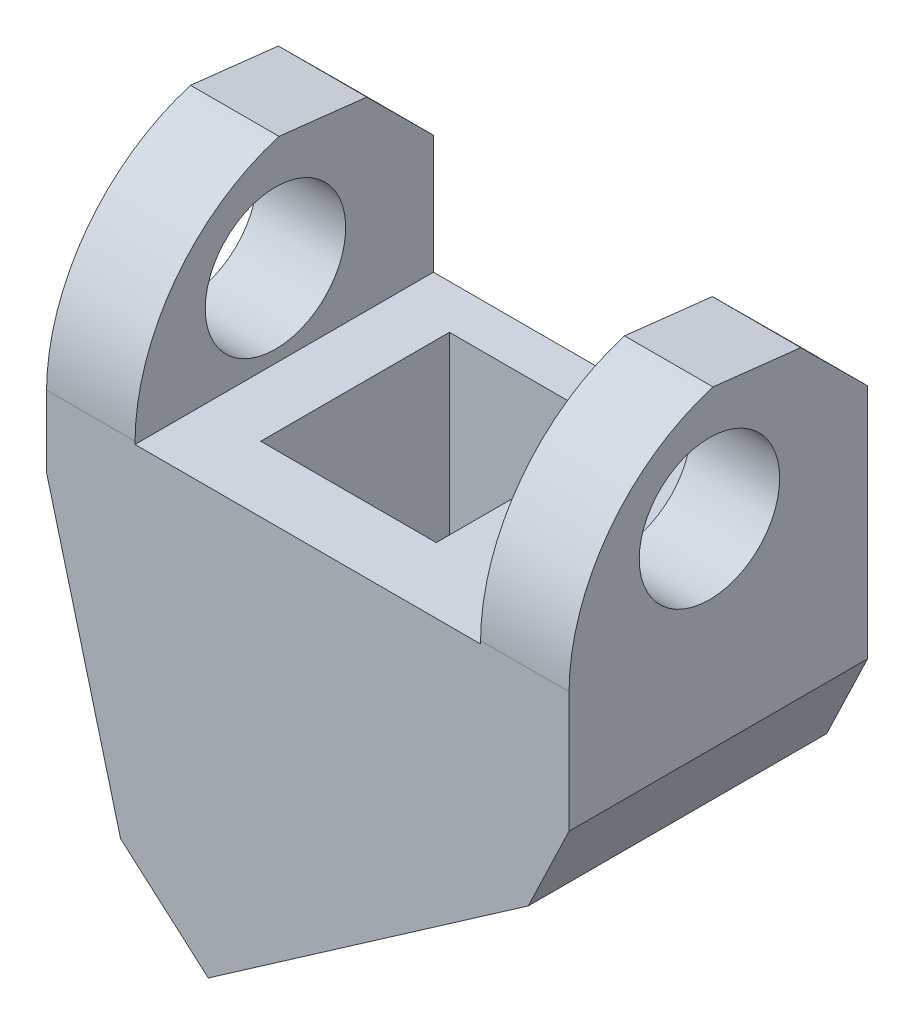
ISO-10303-21;
HEADER;
FILE_DESCRIPTION(('STEP AP214'),'2;1');
FILE_NAME('part.step','',(''),(''),'','','');
FILE_SCHEMA(('AUTOMOTIVE_DESIGN { 1 0 10303 214 1 1 1 1 }'));
ENDSEC;
DATA;
#1=APPLICATION_CONTEXT('core data for automotive mechanical design processes');
#2=APPLICATION_PROTOCOL_DEFINITION('international standard','automotive_design',2000,#1);
#3=PRODUCT_CONTEXT('',#1,'mechanical');
#4=PRODUCT('Part','Part','',(#3));
#5=PRODUCT_RELATED_PRODUCT_CATEGORY('part','',(#4));
#6=PRODUCT_DEFINITION_FORMATION('','',#4);
#7=PRODUCT_DEFINITION_CONTEXT('part definition',#1,'design');
#8=PRODUCT_DEFINITION('design','',#6,#7);
#9=PRODUCT_DEFINITION_SHAPE('','',#8);
#10=(LENGTH_UNIT() NAMED_UNIT(*) SI_UNIT(.MILLI.,.METRE.));
#11=(NAMED_UNIT(*) PLANE_ANGLE_UNIT() SI_UNIT($,.RADIAN.));
#12=(NAMED_UNIT(*) SI_UNIT($,.STERADIAN.) SOLID_ANGLE_UNIT());
#13=UNCERTAINTY_MEASURE_WITH_UNIT(LENGTH_MEASURE(1.E-05),#10,'distance_accuracy_value','');
#14=(GEOMETRIC_REPRESENTATION_CONTEXT(3) GLOBAL_UNCERTAINTY_ASSIGNED_CONTEXT((#13)) GLOBAL_UNIT_ASSIGNED_CONTEXT((#10,
#11,#12)) REPRESENTATION_CONTEXT('',''));
#15=CARTESIAN_POINT('',(0.,0.,0.));
#16=DIRECTION('',(0.,0.,1.));
#17=DIRECTION('',(1.,0.,0.));
#18=AXIS2_PLACEMENT_3D('',#15,#16,#17);
#19=CARTESIAN_POINT('',(14.2253875938206,5.67373352379112,17.));
#20=DIRECTION('',(-0.570729388453815,0.82113821318651,0.));
#21=DIRECTION('',(-0.82113821318651,-0.570729388453815,0.));
#22=AXIS2_PLACEMENT_3D('',#19,#20,#21);
#23=PLANE('',#22);
#24=DIRECTION('',(0.82113821318651,0.570729388453815,0.));
#25=VECTOR('',#24,1.);
#26=CARTESIAN_POINT('',(14.2253875938206,5.67373352379112,0.));
#27=LINE('',#26,#25);
#28=CARTESIAN_POINT('',(-4.00388073891992,-6.99645889988358,0.));
#29=VERTEX_POINT('',#28);
#30=CARTESIAN_POINT('',(14.2253875938206,5.67373352379112,0.));
#31=VERTEX_POINT('',#30);
#32=EDGE_CURVE('E312',#29,#31,#27,.T.);
#33=ORIENTED_EDGE('',*,*,#32,.T.);
#34=DIRECTION('',(0.,0.,-1.));
#35=VECTOR('',#34,1.);
#36=CARTESIAN_POINT('',(14.2253875938206,5.67373352379112,17.));
#37=LINE('',#36,#35);
#38=CARTESIAN_POINT('',(14.2253875938206,5.67373352379112,17.));
#39=VERTEX_POINT('',#38);
#40=EDGE_CURVE('E333',#39,#31,#37,.T.);
#41=ORIENTED_EDGE('',*,*,#40,.F.);
#42=DIRECTION('',(0.82113821318651,0.570729388453815,0.));
#43=VECTOR('',#42,1.);
#44=CARTESIAN_POINT('',(14.2253875938206,5.67373352379112,17.));
#45=LINE('',#44,#43);
#46=CARTESIAN_POINT('',(-4.00388073891992,-6.99645889988358,17.));
#47=VERTEX_POINT('',#46);
#48=EDGE_CURVE('E292',#47,#39,#45,.T.);
#49=ORIENTED_EDGE('',*,*,#48,.F.);
#50=DIRECTION('',(0.,0.,-1.));
#51=VECTOR('',#50,1.);
#52=CARTESIAN_POINT('',(-4.00388073891992,-6.99645889988358,17.));
#53=LINE('',#52,#51);
#54=EDGE_CURVE('E336',#47,#29,#53,.T.);
#55=ORIENTED_EDGE('',*,*,#54,.T.);
#56=EDGE_LOOP('',(#33,#41,#49,#55));
#57=FACE_BOUND('',#56,.T.);
#58=DIRECTION('',(0.82113821318651,0.570729388453815,0.));
#59=VECTOR('',#58,1.);
#60=CARTESIAN_POINT('',(-0.514518451916481,-4.57118922886543,13.26));
#61=LINE('',#60,#59);
#62=CARTESIAN_POINT('',(-0.719327886173876,-4.71354134606832,13.26));
#63=VERTEX_POINT('',#62);
#64=CARTESIAN_POINT('',(7.05685099270237,0.691265962589312,13.26));
#65=VERTEX_POINT('',#64);
#66=EDGE_CURVE('E219',#63,#65,#61,.T.);
#67=ORIENTED_EDGE('',*,*,#66,.T.);
#68=DIRECTION('',(0.,0.,-1.));
#69=VECTOR('',#68,1.);
#70=CARTESIAN_POINT('',(7.05685099270237,0.691265962589311,13.26));
#71=LINE('',#70,#69);
#72=CARTESIAN_POINT('',(7.05685099270237,0.691265962589312,2.51));
#73=VERTEX_POINT('',#72);
#74=EDGE_CURVE('E215',#65,#73,#71,.T.);
#75=ORIENTED_EDGE('',*,*,#74,.T.);
#76=DIRECTION('',(-0.82113821318651,-0.570729388453815,0.));
#77=VECTOR('',#76,1.);
#78=CARTESIAN_POINT('',(-0.51451845191648,-4.57118922886543,2.51));
#79=LINE('',#78,#77);
#80=CARTESIAN_POINT('',(-0.719327886173878,-4.71354134606832,2.51));
#81=VERTEX_POINT('',#80);
#82=EDGE_CURVE('E218',#73,#81,#79,.T.);
#83=ORIENTED_EDGE('',*,*,#82,.T.);
#84=DIRECTION('',(0.,0.,1.));
#85=VECTOR('',#84,1.);
#86=CARTESIAN_POINT('',(-0.719327886173879,-4.71354134606832,13.26));
#87=LINE('',#86,#85);
#88=EDGE_CURVE('E221',#81,#63,#87,.T.);
#89=ORIENTED_EDGE('',*,*,#88,.T.);
#90=EDGE_LOOP('',(#67,#75,#83,#89));
#91=FACE_BOUND('',#90,.T.);
#92=ADVANCED_FACE('F33',(#57,#91),#23,.F.);
#93=CARTESIAN_POINT('',(-13.2171428571429,13.3371428571428,17.));
#94=DIRECTION('',(1.,0.,0.));
#95=DIRECTION('',(0.,0.,-1.));
#96=AXIS2_PLACEMENT_3D('',#93,#94,#95);
#97=PLANE('',#96);
#98=CARTESIAN_POINT('',(-13.2171428571429,21.9371428571428,9.));
#99=DIRECTION('',(-1.,0.,0.));
#100=DIRECTION('',(0.,0.,1.));
#101=AXIS2_PLACEMENT_3D('',#98,#99,#100);
#102=CIRCLE('',#101,4.);
#103=CARTESIAN_POINT('',(-13.2171428571429,21.9371428571428,13.));
#104=VERTEX_POINT('',#103);
#105=EDGE_CURVE('E465',#104,#104,#102,.T.);
#106=ORIENTED_EDGE('',*,*,#105,.F.);
#107=EDGE_LOOP('',(#106));
#108=FACE_BOUND('',#107,.T.);
#109=DIRECTION('',(0.,0.111815815852002,0.99372894861997));
#110=VECTOR('',#109,1.);
#111=CARTESIAN_POINT('',(-13.2171428571429,29.0610495860065,15.2307233157388));
#112=LINE('',#111,#110);
#113=CARTESIAN_POINT('',(-13.2171428571429,27.7745356391118,3.79722312534748));
#114=VERTEX_POINT('',#113);
#115=CARTESIAN_POINT('',(-13.2171428571429,28.3371428571428,8.79722312534747));
#116=VERTEX_POINT('',#115);
#117=EDGE_CURVE('E264',#114,#116,#112,.T.);
#118=ORIENTED_EDGE('',*,*,#117,.F.);
#119=DIRECTION('',(0.,0.705253158861616,0.708955557080775));
#120=VECTOR('',#119,1.);
#121=CARTESIAN_POINT('',(-13.2171428571429,27.1949340284675,3.21457875488832));
#122=LINE('',#121,#120);
#123=CARTESIAN_POINT('',(-13.2171428571429,23.9971428571428,0.));
#124=VERTEX_POINT('',#123);
#125=EDGE_CURVE('E266',#124,#114,#122,.T.);
#126=ORIENTED_EDGE('',*,*,#125,.F.);
#127=DIRECTION('',(0.,-1.,0.));
#128=VECTOR('',#127,1.);
#129=CARTESIAN_POINT('',(-13.2171428571429,13.3371428571428,0.));
#130=LINE('',#129,#128);
#131=CARTESIAN_POINT('',(-13.2171428571429,13.3371428571428,0.));
#132=VERTEX_POINT('',#131);
#133=EDGE_CURVE('E284',#124,#132,#130,.T.);
#134=ORIENTED_EDGE('',*,*,#133,.T.);
#135=DIRECTION('',(0.,0.,-1.));
#136=VECTOR('',#135,1.);
#137=CARTESIAN_POINT('',(-13.2171428571429,13.3371428571428,17.));
#138=LINE('',#137,#136);
#139=CARTESIAN_POINT('',(-13.2171428571429,13.3371428571428,17.));
#140=VERTEX_POINT('',#139);
#141=EDGE_CURVE('E342',#140,#132,#138,.T.);
#142=ORIENTED_EDGE('',*,*,#141,.F.);
#143=DIRECTION('',(0.,-1.,0.));
#144=VECTOR('',#143,1.);
#145=CARTESIAN_POINT('',(-13.2171428571429,13.3371428571428,17.));
#146=LINE('',#145,#144);
#147=CARTESIAN_POINT('',(-13.2171428571429,17.4025988995306,17.));
#148=VERTEX_POINT('',#147);
#149=EDGE_CURVE('E285',#148,#140,#146,.T.);
#150=ORIENTED_EDGE('',*,*,#149,.F.);
#151=CARTESIAN_POINT('',(-13.2171428571429,17.3198708783368,5.50029756582766));
#152=DIRECTION('',(1.,0.,0.));
#153=DIRECTION('',(0.,0.,-1.));
#154=AXIS2_PLACEMENT_3D('',#151,#152,#153);
#155=CIRCLE('',#154,11.5);
#156=EDGE_CURVE('E281',#148,#116,#155,.F.);
#157=ORIENTED_EDGE('',*,*,#156,.T.);
#158=EDGE_LOOP('',(#118,#126,#134,#142,#150,#157));
#159=FACE_BOUND('',#158,.T.);
#160=ADVANCED_FACE('F35',(#108,#159),#97,.F.);
#161=CARTESIAN_POINT('',(-8.17714285714285,28.3371428571428,17.));
#162=DIRECTION('',(-1.,0.,0.));
#163=DIRECTION('',(0.,-1.,0.));
#164=AXIS2_PLACEMENT_3D('',#161,#162,#163);
#165=PLANE('',#164);
#166=CARTESIAN_POINT('',(-8.17714285714285,21.9371428571428,9.));
#167=DIRECTION('',(-1.,0.,0.));
#168=DIRECTION('',(0.,-1.,0.));
#169=AXIS2_PLACEMENT_3D('',#166,#167,#168);
#170=CIRCLE('',#169,4.);
#171=CARTESIAN_POINT('',(-8.17714285714285,17.9371428571428,9.));
#172=VERTEX_POINT('',#171);
#173=EDGE_CURVE('E460',#172,#172,#170,.T.);
#174=ORIENTED_EDGE('',*,*,#173,.T.);
#175=EDGE_LOOP('',(#174));
#176=FACE_BOUND('',#175,.T.);
#177=DIRECTION('',(0.,0.111815815852002,0.99372894861997));
#178=VECTOR('',#177,1.);
#179=CARTESIAN_POINT('',(-8.17714285714285,27.005349844249,-3.03868094956568));
#180=LINE('',#179,#178);
#181=CARTESIAN_POINT('',(-8.17714285714285,27.7745356391118,3.79722312534748));
#182=VERTEX_POINT('',#181);
#183=CARTESIAN_POINT('',(-8.17714285714285,28.3371428571428,8.79722312534747));
#184=VERTEX_POINT('',#183);
#185=EDGE_CURVE('E256',#182,#184,#180,.T.);
#186=ORIENTED_EDGE('',*,*,#185,.T.);
#187=CARTESIAN_POINT('',(-8.17714285714285,17.3198708783368,5.50029756582766));
#188=DIRECTION('',(-1.,0.,0.));
#189=DIRECTION('',(0.,-1.,0.));
#190=AXIS2_PLACEMENT_3D('',#187,#188,#189);
#191=CIRCLE('',#190,11.5);
#192=CARTESIAN_POINT('',(-8.17714285714285,17.4025988995306,17.));
#193=VERTEX_POINT('',#192);
#194=EDGE_CURVE('E272',#184,#193,#191,.F.);
#195=ORIENTED_EDGE('',*,*,#194,.T.);
#196=DIRECTION('',(0.,1.,0.));
#197=VECTOR('',#196,1.);
#198=CARTESIAN_POINT('',(-8.17714285714285,28.3371428571428,17.));
#199=LINE('',#198,#197);
#200=CARTESIAN_POINT('',(-8.17714285714285,17.2371428571428,17.));
#201=VERTEX_POINT('',#200);
#202=EDGE_CURVE('E303',#201,#193,#199,.T.);
#203=ORIENTED_EDGE('',*,*,#202,.F.);
#204=DIRECTION('',(0.,0.,-1.));
#205=VECTOR('',#204,1.);
#206=CARTESIAN_POINT('',(-8.17714285714285,17.2371428571428,17.));
#207=LINE('',#206,#205);
#208=CARTESIAN_POINT('',(-8.17714285714285,17.2371428571428,0.));
#209=VERTEX_POINT('',#208);
#210=EDGE_CURVE('E306',#201,#209,#207,.T.);
#211=ORIENTED_EDGE('',*,*,#210,.T.);
#212=DIRECTION('',(0.,1.,0.));
#213=VECTOR('',#212,1.);
#214=CARTESIAN_POINT('',(-8.17714285714285,28.3371428571428,0.));
#215=LINE('',#214,#213);
#216=CARTESIAN_POINT('',(-8.17714285714285,23.9971428571428,0.));
#217=VERTEX_POINT('',#216);
#218=EDGE_CURVE('E288',#209,#217,#215,.T.);
#219=ORIENTED_EDGE('',*,*,#218,.T.);
#220=DIRECTION('',(0.,0.705253158861616,0.708955557080775));
#221=VECTOR('',#220,1.);
#222=CARTESIAN_POINT('',(-8.17714285714285,12.0613955146002,-11.9984069551231));
#223=LINE('',#222,#221);
#224=EDGE_CURVE('E259',#217,#182,#223,.T.);
#225=ORIENTED_EDGE('',*,*,#224,.T.);
#226=EDGE_LOOP('',(#186,#195,#203,#211,#219,#225));
#227=FACE_BOUND('',#226,.T.);
#228=ADVANCED_FACE('F370',(#176,#227),#165,.F.);
#229=CARTESIAN_POINT('',(0.,0.,0.));
#230=DIRECTION('',(0.,0.,-1.));
#231=DIRECTION('',(-1.,0.,0.));
#232=AXIS2_PLACEMENT_3D('',#229,#230,#231);
#233=PLANE('',#232);
#234=DIRECTION('',(-1.,0.,0.));
#235=VECTOR('',#234,1.);
#236=CARTESIAN_POINT('',(18.8228571428571,23.9971428571429,0.));
#237=LINE('',#236,#235);
#238=CARTESIAN_POINT('',(16.5455947586633,23.9971428571429,0.));
#239=VERTEX_POINT('',#238);
#240=CARTESIAN_POINT('',(11.5055947586633,23.9971428571428,0.));
#241=VERTEX_POINT('',#240);
#242=EDGE_CURVE('E224',#239,#241,#237,.T.);
#243=ORIENTED_EDGE('',*,*,#242,.F.);
#244=DIRECTION('',(0.,1.,0.));
#245=VECTOR('',#244,1.);
#246=CARTESIAN_POINT('',(16.5455947586633,28.3371428571428,0.));
#247=LINE('',#246,#245);
#248=CARTESIAN_POINT('',(16.5455947586633,10.5166188943334,0.));
#249=VERTEX_POINT('',#248);
#250=EDGE_CURVE('E316',#249,#239,#247,.T.);
#251=ORIENTED_EDGE('',*,*,#250,.F.);
#252=DIRECTION('',(0.432068373341291,0.901840851125192,0.));
#253=VECTOR('',#252,1.);
#254=CARTESIAN_POINT('',(16.5455947586633,10.5166188943334,0.));
#255=LINE('',#254,#253);
#256=EDGE_CURVE('E314',#31,#249,#255,.T.);
#257=ORIENTED_EDGE('',*,*,#256,.F.);
#258=ORIENTED_EDGE('',*,*,#32,.F.);
#259=DIRECTION('',(0.752427599560253,-0.658674963407595,0.));
#260=VECTOR('',#259,1.);
#261=CARTESIAN_POINT('',(-4.00388073891992,-6.99645889988358,0.));
#262=LINE('',#261,#260);
#263=CARTESIAN_POINT('',(-9.,-2.62285714285716,0.));
#264=VERTEX_POINT('',#263);
#265=EDGE_CURVE('E310',#264,#29,#262,.T.);
#266=ORIENTED_EDGE('',*,*,#265,.F.);
#267=DIRECTION('',(0.255464385431467,-0.966818466815835,0.));
#268=VECTOR('',#267,1.);
#269=CARTESIAN_POINT('',(-9.,-2.62285714285716,0.));
#270=LINE('',#269,#268);
#271=EDGE_CURVE('E308',#132,#264,#270,.T.);
#272=ORIENTED_EDGE('',*,*,#271,.F.);
#273=ORIENTED_EDGE('',*,*,#133,.F.);
#274=DIRECTION('',(1.,0.,0.));
#275=VECTOR('',#274,1.);
#276=CARTESIAN_POINT('',(0.,23.9971428571429,0.));
#277=LINE('',#276,#275);
#278=EDGE_CURVE('E42',#124,#217,#277,.T.);
#279=ORIENTED_EDGE('',*,*,#278,.T.);
#280=ORIENTED_EDGE('',*,*,#218,.F.);
#281=DIRECTION('',(-1.,0.,0.));
#282=VECTOR('',#281,1.);
#283=CARTESIAN_POINT('',(-8.17714285714285,17.2371428571428,0.));
#284=LINE('',#283,#282);
#285=CARTESIAN_POINT('',(11.5055947586633,17.2371428571428,0.));
#286=VERTEX_POINT('',#285);
#287=EDGE_CURVE('E321',#286,#209,#284,.T.);
#288=ORIENTED_EDGE('',*,*,#287,.F.);
#289=DIRECTION('',(0.,-1.,0.));
#290=VECTOR('',#289,1.);
#291=CARTESIAN_POINT('',(11.5055947586633,17.2371428571428,0.));
#292=LINE('',#291,#290);
#293=EDGE_CURVE('E319',#241,#286,#292,.T.);
#294=ORIENTED_EDGE('',*,*,#293,.F.);
#295=EDGE_LOOP('',(#243,#251,#257,#258,#266,#272,#273,#279,#280,#288,#294));
#296=FACE_BOUND('',#295,.T.);
#297=ADVANCED_FACE('F409',(#296),#233,.T.);
#298=CARTESIAN_POINT('',(-9.,-2.62285714285716,17.));
#299=DIRECTION('',(0.966818466815836,0.255464385431467,0.));
#300=DIRECTION('',(-0.255464385431467,0.966818466815836,0.));
#301=AXIS2_PLACEMENT_3D('',#298,#299,#300);
#302=PLANE('',#301);
#303=ORIENTED_EDGE('',*,*,#271,.T.);
#304=DIRECTION('',(0.,0.,-1.));
#305=VECTOR('',#304,1.);
#306=CARTESIAN_POINT('',(-9.,-2.62285714285716,17.));
#307=LINE('',#306,#305);
#308=CARTESIAN_POINT('',(-9.,-2.62285714285716,17.));
#309=VERTEX_POINT('',#308);
#310=EDGE_CURVE('E339',#309,#264,#307,.T.);
#311=ORIENTED_EDGE('',*,*,#310,.F.);
#312=DIRECTION('',(0.255464385431467,-0.966818466815835,0.));
#313=VECTOR('',#312,1.);
#314=CARTESIAN_POINT('',(-9.,-2.62285714285716,17.));
#315=LINE('',#314,#313);
#316=EDGE_CURVE('E287',#140,#309,#315,.T.);
#317=ORIENTED_EDGE('',*,*,#316,.F.);
#318=ORIENTED_EDGE('',*,*,#141,.T.);
#319=EDGE_LOOP('',(#303,#311,#317,#318));
#320=FACE_BOUND('',#319,.T.);
#321=ADVANCED_FACE('F383',(#320),#302,.F.);
#322=CARTESIAN_POINT('',(-4.00388073891992,-6.99645889988358,17.));
#323=DIRECTION('',(0.658674963407595,0.752427599560253,0.));
#324=DIRECTION('',(-0.752427599560253,0.658674963407595,0.));
#325=AXIS2_PLACEMENT_3D('',#322,#323,#324);
#326=PLANE('',#325);
#327=ORIENTED_EDGE('',*,*,#265,.T.);
#328=ORIENTED_EDGE('',*,*,#54,.F.);
#329=DIRECTION('',(0.752427599560253,-0.658674963407595,0.));
#330=VECTOR('',#329,1.);
#331=CARTESIAN_POINT('',(-4.00388073891992,-6.99645889988358,17.));
#332=LINE('',#331,#330);
#333=EDGE_CURVE('E290',#309,#47,#332,.T.);
#334=ORIENTED_EDGE('',*,*,#333,.F.);
#335=ORIENTED_EDGE('',*,*,#310,.T.);
#336=EDGE_LOOP('',(#327,#328,#334,#335));
#337=FACE_BOUND('',#336,.T.);
#338=ADVANCED_FACE('F389',(#337),#326,.F.);
#339=CARTESIAN_POINT('',(16.5455947586633,10.5166188943334,17.));
#340=DIRECTION('',(-0.901840851125192,0.432068373341291,0.));
#341=DIRECTION('',(-0.432068373341291,-0.901840851125192,0.));
#342=AXIS2_PLACEMENT_3D('',#339,#340,#341);
#343=PLANE('',#342);
#344=ORIENTED_EDGE('',*,*,#256,.T.);
#345=DIRECTION('',(0.,0.,-1.));
#346=VECTOR('',#345,1.);
#347=CARTESIAN_POINT('',(16.5455947586633,10.5166188943334,17.));
#348=LINE('',#347,#346);
#349=CARTESIAN_POINT('',(16.5455947586633,10.5166188943334,17.));
#350=VERTEX_POINT('',#349);
#351=EDGE_CURVE('E330',#350,#249,#348,.T.);
#352=ORIENTED_EDGE('',*,*,#351,.F.);
#353=DIRECTION('',(0.432068373341291,0.901840851125192,0.));
#354=VECTOR('',#353,1.);
#355=CARTESIAN_POINT('',(16.5455947586633,10.5166188943334,17.));
#356=LINE('',#355,#354);
#357=EDGE_CURVE('E294',#39,#350,#356,.T.);
#358=ORIENTED_EDGE('',*,*,#357,.F.);
#359=ORIENTED_EDGE('',*,*,#40,.T.);
#360=EDGE_LOOP('',(#344,#352,#358,#359));
#361=FACE_BOUND('',#360,.T.);
#362=ADVANCED_FACE('F399',(#361),#343,.F.);
#363=CARTESIAN_POINT('',(16.5455947586633,28.3371428571428,17.));
#364=DIRECTION('',(-1.,0.,0.));
#365=DIRECTION('',(0.,-1.,0.));
#366=AXIS2_PLACEMENT_3D('',#363,#364,#365);
#367=PLANE('',#366);
#368=CARTESIAN_POINT('',(16.5455947586633,21.9371428571428,9.));
#369=DIRECTION('',(-1.,0.,0.));
#370=DIRECTION('',(0.,-1.,0.));
#371=AXIS2_PLACEMENT_3D('',#368,#369,#370);
#372=CIRCLE('',#371,4.);
#373=CARTESIAN_POINT('',(16.5455947586633,17.9371428571428,9.));
#374=VERTEX_POINT('',#373);
#375=EDGE_CURVE('E458',#374,#374,#372,.T.);
#376=ORIENTED_EDGE('',*,*,#375,.T.);
#377=EDGE_LOOP('',(#376));
#378=FACE_BOUND('',#377,.T.);
#379=DIRECTION('',(0.,0.705253158861616,0.708955557080775));
#380=VECTOR('',#379,1.);
#381=CARTESIAN_POINT('',(16.5455947586633,34.6556642997318,10.714475946744));
#382=LINE('',#381,#380);
#383=CARTESIAN_POINT('',(16.5455947586633,27.7745356391118,3.79722312534748));
#384=VERTEX_POINT('',#383);
#385=EDGE_CURVE('E253',#239,#384,#382,.T.);
#386=ORIENTED_EDGE('',*,*,#385,.T.);
#387=DIRECTION('',(0.,0.111815815852002,0.99372894861997));
#388=VECTOR('',#387,1.);
#389=CARTESIAN_POINT('',(16.5455947586633,29.2485912361263,16.8974425126242));
#390=LINE('',#389,#388);
#391=CARTESIAN_POINT('',(16.5455947586633,28.3371428571428,8.79722312534747));
#392=VERTEX_POINT('',#391);
#393=EDGE_CURVE('E250',#384,#392,#390,.T.);
#394=ORIENTED_EDGE('',*,*,#393,.T.);
#395=CARTESIAN_POINT('',(16.5455947586633,17.3198708783368,5.50029756582766));
#396=DIRECTION('',(-1.,0.,0.));
#397=DIRECTION('',(0.,-1.,0.));
#398=AXIS2_PLACEMENT_3D('',#395,#396,#397);
#399=CIRCLE('',#398,11.5);
#400=CARTESIAN_POINT('',(16.5455947586633,17.4025988995306,17.));
#401=VERTEX_POINT('',#400);
#402=EDGE_CURVE('E278',#392,#401,#399,.F.);
#403=ORIENTED_EDGE('',*,*,#402,.T.);
#404=DIRECTION('',(0.,1.,0.));
#405=VECTOR('',#404,1.);
#406=CARTESIAN_POINT('',(16.5455947586633,28.3371428571428,17.));
#407=LINE('',#406,#405);
#408=EDGE_CURVE('E296',#350,#401,#407,.T.);
#409=ORIENTED_EDGE('',*,*,#408,.F.);
#410=ORIENTED_EDGE('',*,*,#351,.T.);
#411=ORIENTED_EDGE('',*,*,#250,.T.);
#412=EDGE_LOOP('',(#386,#394,#403,#409,#410,#411));
#413=FACE_BOUND('',#412,.T.);
#414=ADVANCED_FACE('F402',(#378,#413),#367,.F.);
#415=CARTESIAN_POINT('',(11.5055947586633,17.2371428571428,17.));
#416=DIRECTION('',(1.,0.,0.));
#417=DIRECTION('',(0.,1.,0.));
#418=AXIS2_PLACEMENT_3D('',#415,#416,#417);
#419=PLANE('',#418);
#420=CARTESIAN_POINT('',(11.5055947586633,21.9371428571428,9.));
#421=DIRECTION('',(1.,0.,0.));
#422=DIRECTION('',(0.,1.,0.));
#423=AXIS2_PLACEMENT_3D('',#420,#421,#422);
#424=CIRCLE('',#423,4.);
#425=CARTESIAN_POINT('',(11.5055947586633,25.9371428571428,9.));
#426=VERTEX_POINT('',#425);
#427=EDGE_CURVE('E37',#426,#426,#424,.T.);
#428=ORIENTED_EDGE('',*,*,#427,.T.);
#429=EDGE_LOOP('',(#428));
#430=FACE_BOUND('',#429,.T.);
#431=CARTESIAN_POINT('',(11.5055947586633,17.3198708783368,5.50029756582766));
#432=DIRECTION('',(1.,0.,0.));
#433=DIRECTION('',(0.,1.,0.));
#434=AXIS2_PLACEMENT_3D('',#431,#432,#433);
#435=CIRCLE('',#434,11.5);
#436=CARTESIAN_POINT('',(11.5055947586633,17.4025988995306,17.));
#437=VERTEX_POINT('',#436);
#438=CARTESIAN_POINT('',(11.5055947586633,28.3371428571428,8.79722312534747));
#439=VERTEX_POINT('',#438);
#440=EDGE_CURVE('E275',#437,#439,#435,.F.);
#441=ORIENTED_EDGE('',*,*,#440,.T.);
#442=DIRECTION('',(0.,-0.111815815852002,-0.99372894861997));
#443=VECTOR('',#442,1.);
#444=CARTESIAN_POINT('',(11.5055947586633,29.1098104150376,15.664070306929));
#445=LINE('',#444,#443);
#446=CARTESIAN_POINT('',(11.5055947586633,27.7745356391118,3.79722312534748));
#447=VERTEX_POINT('',#446);
#448=EDGE_CURVE('E247',#439,#447,#445,.T.);
#449=ORIENTED_EDGE('',*,*,#448,.T.);
#450=DIRECTION('',(0.,-0.705253158861616,-0.708955557080775));
#451=VECTOR('',#450,1.);
#452=CARTESIAN_POINT('',(11.5055947586633,29.1347238989962,5.16455202477079));
#453=LINE('',#452,#451);
#454=EDGE_CURVE('E11',#447,#241,#453,.T.);
#455=ORIENTED_EDGE('',*,*,#454,.T.);
#456=ORIENTED_EDGE('',*,*,#293,.T.);
#457=DIRECTION('',(0.,0.,-1.));
#458=VECTOR('',#457,1.);
#459=CARTESIAN_POINT('',(11.5055947586633,17.2371428571428,17.));
#460=LINE('',#459,#458);
#461=CARTESIAN_POINT('',(11.5055947586633,17.2371428571428,17.));
#462=VERTEX_POINT('',#461);
#463=EDGE_CURVE('E327',#462,#286,#460,.T.);
#464=ORIENTED_EDGE('',*,*,#463,.F.);
#465=DIRECTION('',(0.,-1.,0.));
#466=VECTOR('',#465,1.);
#467=CARTESIAN_POINT('',(11.5055947586633,17.2371428571428,17.));
#468=LINE('',#467,#466);
#469=EDGE_CURVE('E299',#437,#462,#468,.T.);
#470=ORIENTED_EDGE('',*,*,#469,.F.);
#471=EDGE_LOOP('',(#441,#449,#455,#456,#464,#470));
#472=FACE_BOUND('',#471,.T.);
#473=ADVANCED_FACE('F362',(#430,#472),#419,.F.);
#474=CARTESIAN_POINT('',(-8.17714285714285,17.2371428571428,17.));
#475=DIRECTION('',(0.,-1.,0.));
#476=DIRECTION('',(0.,0.,-1.));
#477=AXIS2_PLACEMENT_3D('',#474,#475,#476);
#478=PLANE('',#477);
#479=DIRECTION('',(1.,0.,0.));
#480=VECTOR('',#479,1.);
#481=CARTESIAN_POINT('',(-4.75714285714285,17.2371428571428,13.26));
#482=LINE('',#481,#480);
#483=CARTESIAN_POINT('',(-4.75714285714285,17.2371428571428,13.26));
#484=VERTEX_POINT('',#483);
#485=CARTESIAN_POINT('',(5.24285714285715,17.2371428571428,13.26));
#486=VERTEX_POINT('',#485);
#487=EDGE_CURVE('E194',#484,#486,#482,.T.);
#488=ORIENTED_EDGE('',*,*,#487,.F.);
#489=DIRECTION('',(0.,0.,1.));
#490=VECTOR('',#489,1.);
#491=CARTESIAN_POINT('',(-4.75714285714285,17.2371428571428,2.51));
#492=LINE('',#491,#490);
#493=CARTESIAN_POINT('',(-4.75714285714285,17.2371428571428,2.51));
#494=VERTEX_POINT('',#493);
#495=EDGE_CURVE('E49',#494,#484,#492,.T.);
#496=ORIENTED_EDGE('',*,*,#495,.F.);
#497=DIRECTION('',(-1.,0.,0.));
#498=VECTOR('',#497,1.);
#499=CARTESIAN_POINT('',(-4.75714285714285,17.2371428571428,2.51));
#500=LINE('',#499,#498);
#501=CARTESIAN_POINT('',(5.24285714285715,17.2371428571428,2.51));
#502=VERTEX_POINT('',#501);
#503=EDGE_CURVE('E202',#502,#494,#500,.T.);
#504=ORIENTED_EDGE('',*,*,#503,.F.);
#505=DIRECTION('',(0.,0.,-1.));
#506=VECTOR('',#505,1.);
#507=CARTESIAN_POINT('',(5.24285714285715,17.2371428571428,2.51));
#508=LINE('',#507,#506);
#509=EDGE_CURVE('E185',#486,#502,#508,.T.);
#510=ORIENTED_EDGE('',*,*,#509,.F.);
#511=EDGE_LOOP('',(#488,#496,#504,#510));
#512=FACE_BOUND('',#511,.T.);
#513=ORIENTED_EDGE('',*,*,#287,.T.);
#514=ORIENTED_EDGE('',*,*,#210,.F.);
#515=DIRECTION('',(-1.,0.,0.));
#516=VECTOR('',#515,1.);
#517=CARTESIAN_POINT('',(-8.17714285714285,17.2371428571428,17.));
#518=LINE('',#517,#516);
#519=EDGE_CURVE('E301',#462,#201,#518,.T.);
#520=ORIENTED_EDGE('',*,*,#519,.F.);
#521=ORIENTED_EDGE('',*,*,#463,.T.);
#522=EDGE_LOOP('',(#513,#514,#520,#521));
#523=FACE_BOUND('',#522,.T.);
#524=ADVANCED_FACE('F199',(#512,#523),#478,.F.);
#525=CARTESIAN_POINT('',(0.,0.,17.));
#526=DIRECTION('',(0.,0.,-1.));
#527=DIRECTION('',(-1.,0.,0.));
#528=AXIS2_PLACEMENT_3D('',#525,#526,#527);
#529=PLANE('',#528);
#530=ORIENTED_EDGE('',*,*,#408,.T.);
#531=DIRECTION('',(-1.,0.,0.));
#532=VECTOR('',#531,1.);
#533=CARTESIAN_POINT('',(18.8228571428572,17.4025988995306,17.));
#534=LINE('',#533,#532);
#535=EDGE_CURVE('E348',#401,#437,#534,.T.);
#536=ORIENTED_EDGE('',*,*,#535,.T.);
#537=ORIENTED_EDGE('',*,*,#469,.T.);
#538=ORIENTED_EDGE('',*,*,#519,.T.);
#539=ORIENTED_EDGE('',*,*,#202,.T.);
#540=EDGE_CURVE('E345',#193,#148,#534,.T.);
#541=ORIENTED_EDGE('',*,*,#540,.T.);
#542=ORIENTED_EDGE('',*,*,#149,.T.);
#543=ORIENTED_EDGE('',*,*,#316,.T.);
#544=ORIENTED_EDGE('',*,*,#333,.T.);
#545=ORIENTED_EDGE('',*,*,#48,.T.);
#546=ORIENTED_EDGE('',*,*,#357,.T.);
#547=EDGE_LOOP('',(#530,#536,#537,#538,#539,#541,#542,#543,#544,#545,#546));
#548=FACE_BOUND('',#547,.T.);
#549=ADVANCED_FACE('F356',(#548),#529,.F.);
#550=CARTESIAN_POINT('',(18.8228571428572,17.3198708783368,5.50029756582766));
#551=DIRECTION('',(-1.,0.,0.));
#552=DIRECTION('',(0.,-1.,0.));
#553=AXIS2_PLACEMENT_3D('',#550,#551,#552);
#554=CYLINDRICAL_SURFACE('',#553,11.5);
#555=ORIENTED_EDGE('',*,*,#540,.F.);
#556=ORIENTED_EDGE('',*,*,#194,.F.);
#557=DIRECTION('',(-1.,0.,0.));
#558=VECTOR('',#557,1.);
#559=CARTESIAN_POINT('',(18.8228571428571,28.3371428571428,8.79722312534747));
#560=LINE('',#559,#558);
#561=EDGE_CURVE('E268',#184,#116,#560,.T.);
#562=ORIENTED_EDGE('',*,*,#561,.T.);
#563=ORIENTED_EDGE('',*,*,#156,.F.);
#564=EDGE_LOOP('',(#555,#556,#562,#563));
#565=FACE_BOUND('',#564,.T.);
#566=ADVANCED_FACE('F375',(#565),#554,.T.);
#567=EDGE_CURVE('E269',#392,#439,#560,.T.);
#568=ORIENTED_EDGE('',*,*,#567,.T.);
#569=ORIENTED_EDGE('',*,*,#440,.F.);
#570=ORIENTED_EDGE('',*,*,#535,.F.);
#571=ORIENTED_EDGE('',*,*,#402,.F.);
#572=EDGE_LOOP('',(#568,#569,#570,#571));
#573=FACE_BOUND('',#572,.T.);
#574=ADVANCED_FACE('F403',(#573),#554,.T.);
#575=CARTESIAN_POINT('',(-25.1771428571429,12.0613955146002,-11.9984069551231));
#576=DIRECTION('',(0.,0.708955557080775,-0.705253158861616));
#577=DIRECTION('',(0.,0.705253158861616,0.708955557080775));
#578=AXIS2_PLACEMENT_3D('',#575,#576,#577);
#579=PLANE('',#578);
#580=ORIENTED_EDGE('',*,*,#125,.T.);
#581=DIRECTION('',(1.,0.,0.));
#582=VECTOR('',#581,1.);
#583=CARTESIAN_POINT('',(-25.1771428571429,27.7745356391118,3.79722312534748));
#584=LINE('',#583,#582);
#585=EDGE_CURVE('E262',#114,#182,#584,.T.);
#586=ORIENTED_EDGE('',*,*,#585,.T.);
#587=ORIENTED_EDGE('',*,*,#224,.F.);
#588=ORIENTED_EDGE('',*,*,#278,.F.);
#589=EDGE_LOOP('',(#580,#586,#587,#588));
#590=FACE_BOUND('',#589,.T.);
#591=ADVANCED_FACE('F411',(#590),#579,.T.);
#592=CARTESIAN_POINT('',(-25.1771428571429,27.005349844249,-3.03868094956568));
#593=DIRECTION('',(0.,0.99372894861997,-0.111815815852002));
#594=DIRECTION('',(0.,0.111815815852002,0.99372894861997));
#595=AXIS2_PLACEMENT_3D('',#592,#593,#594);
#596=PLANE('',#595);
#597=ORIENTED_EDGE('',*,*,#117,.T.);
#598=ORIENTED_EDGE('',*,*,#561,.F.);
#599=ORIENTED_EDGE('',*,*,#185,.F.);
#600=ORIENTED_EDGE('',*,*,#585,.F.);
#601=EDGE_LOOP('',(#597,#598,#599,#600));
#602=FACE_BOUND('',#601,.T.);
#603=ADVANCED_FACE('F414',(#602),#596,.T.);
#604=CARTESIAN_POINT('',(18.8228571428572,12.0613955146002,-11.9984069551231));
#605=DIRECTION('',(0.,-0.708955557080775,0.705253158861616));
#606=DIRECTION('',(0.,-0.705253158861616,-0.708955557080775));
#607=AXIS2_PLACEMENT_3D('',#604,#605,#606);
#608=PLANE('',#607);
#609=ORIENTED_EDGE('',*,*,#242,.T.);
#610=ORIENTED_EDGE('',*,*,#454,.F.);
#611=DIRECTION('',(-1.,0.,0.));
#612=VECTOR('',#611,1.);
#613=CARTESIAN_POINT('',(18.8228571428571,27.7745356391118,3.79722312534748));
#614=LINE('',#613,#612);
#615=EDGE_CURVE('E244',#384,#447,#614,.T.);
#616=ORIENTED_EDGE('',*,*,#615,.F.);
#617=ORIENTED_EDGE('',*,*,#385,.F.);
#618=EDGE_LOOP('',(#609,#610,#616,#617));
#619=FACE_BOUND('',#618,.T.);
#620=ADVANCED_FACE('F416',(#619),#608,.F.);
#621=CARTESIAN_POINT('',(18.8228571428571,27.005349844249,-3.03868094956568));
#622=DIRECTION('',(0.,-0.99372894861997,0.111815815852002));
#623=DIRECTION('',(0.,-0.111815815852002,-0.99372894861997));
#624=AXIS2_PLACEMENT_3D('',#621,#622,#623);
#625=PLANE('',#624);
#626=ORIENTED_EDGE('',*,*,#615,.T.);
#627=ORIENTED_EDGE('',*,*,#448,.F.);
#628=ORIENTED_EDGE('',*,*,#567,.F.);
#629=ORIENTED_EDGE('',*,*,#393,.F.);
#630=EDGE_LOOP('',(#626,#627,#628,#629));
#631=FACE_BOUND('',#630,.T.);
#632=ADVANCED_FACE('F405',(#631),#625,.F.);
#633=CARTESIAN_POINT('',(-4.79716617313218,3.08699610535319,0.));
#634=DIRECTION('',(0.570729388453815,-0.82113821318651,0.));
#635=DIRECTION('',(0.82113821318651,0.570729388453815,0.));
#636=AXIS2_PLACEMENT_3D('',#633,#634,#635);
#637=PLANE('',#636);
#638=DIRECTION('',(0.,0.,-1.));
#639=VECTOR('',#638,1.);
#640=CARTESIAN_POINT('',(-4.75714285714285,3.11481417823259,0.));
#641=LINE('',#640,#639);
#642=CARTESIAN_POINT('',(-4.75714285714285,3.11481417823259,13.26));
#643=VERTEX_POINT('',#642);
#644=CARTESIAN_POINT('',(-4.75714285714285,3.11481417823259,2.51));
#645=VERTEX_POINT('',#644);
#646=EDGE_CURVE('E209',#643,#645,#641,.T.);
#647=ORIENTED_EDGE('',*,*,#646,.F.);
#648=DIRECTION('',(-0.82113821318651,-0.570729388453815,0.));
#649=VECTOR('',#648,1.);
#650=CARTESIAN_POINT('',(-7.49117628221616,1.21453332460003,13.26));
#651=LINE('',#650,#649);
#652=CARTESIAN_POINT('',(-7.49117628221616,1.21453332460003,13.26));
#653=VERTEX_POINT('',#652);
#654=EDGE_CURVE('E236',#643,#653,#651,.T.);
#655=ORIENTED_EDGE('',*,*,#654,.T.);
#656=DIRECTION('',(0.,0.,-1.));
#657=VECTOR('',#656,1.);
#658=CARTESIAN_POINT('',(-7.49117628221616,1.21453332460003,13.26));
#659=LINE('',#658,#657);
#660=CARTESIAN_POINT('',(-7.49117628221616,1.21453332460003,2.51));
#661=VERTEX_POINT('',#660);
#662=EDGE_CURVE('E225',#653,#661,#659,.T.);
#663=ORIENTED_EDGE('',*,*,#662,.T.);
#664=DIRECTION('',(0.82113821318651,0.570729388453815,0.));
#665=VECTOR('',#664,1.);
#666=CARTESIAN_POINT('',(-7.49117628221615,1.21453332460003,2.51));
#667=LINE('',#666,#665);
#668=EDGE_CURVE('E228',#661,#645,#667,.T.);
#669=ORIENTED_EDGE('',*,*,#668,.T.);
#670=EDGE_LOOP('',(#647,#655,#663,#669));
#671=FACE_BOUND('',#670,.T.);
#672=ADVANCED_FACE('F500',(#671),#637,.T.);
#673=CARTESIAN_POINT('',(0.0564247056093329,-5.39263500279328,13.26));
#674=DIRECTION('',(0.,0.,-1.));
#675=DIRECTION('',(-1.,0.,0.));
#676=AXIS2_PLACEMENT_3D('',#673,#674,#675);
#677=PLANE('',#676);
#678=ORIENTED_EDGE('',*,*,#654,.F.);
#679=DIRECTION('',(0.,1.,0.));
#680=VECTOR('',#679,1.);
#681=CARTESIAN_POINT('',(-4.75714285714285,-22.6533129127288,13.26));
#682=LINE('',#681,#680);
#683=EDGE_CURVE('E191',#643,#484,#682,.T.);
#684=ORIENTED_EDGE('',*,*,#683,.T.);
#685=ORIENTED_EDGE('',*,*,#487,.T.);
#686=DIRECTION('',(0.,1.,0.));
#687=VECTOR('',#686,1.);
#688=CARTESIAN_POINT('',(5.24285714285715,-22.6533129127288,13.26));
#689=LINE('',#688,#687);
#690=CARTESIAN_POINT('',(5.24285714285715,2.27923579964301,13.26));
#691=VERTEX_POINT('',#690);
#692=EDGE_CURVE('E57',#691,#486,#689,.T.);
#693=ORIENTED_EDGE('',*,*,#692,.F.);
#694=DIRECTION('',(-0.752427599560253,0.658674963407595,0.));
#695=VECTOR('',#694,1.);
#696=CARTESIAN_POINT('',(7.83260358448558,0.0121723058643546,13.26));
#697=LINE('',#696,#695);
#698=EDGE_CURVE('E229',#65,#691,#697,.T.);
#699=ORIENTED_EDGE('',*,*,#698,.F.);
#700=ORIENTED_EDGE('',*,*,#66,.F.);
#701=DIRECTION('',(-0.752427599560253,0.658674963407595,0.));
#702=VECTOR('',#701,1.);
#703=CARTESIAN_POINT('',(0.0564247056093329,-5.39263500279328,13.26));
#704=LINE('',#703,#702);
#705=EDGE_CURVE('E214',#63,#653,#704,.T.);
#706=ORIENTED_EDGE('',*,*,#705,.T.);
#707=EDGE_LOOP('',(#678,#684,#685,#693,#699,#700,#706));
#708=FACE_BOUND('',#707,.T.);
#709=ADVANCED_FACE('F196',(#708),#677,.T.);
#710=CARTESIAN_POINT('',(7.83260358448558,0.0121723058643546,13.26));
#711=DIRECTION('',(-0.658674963407594,-0.752427599560253,0.));
#712=DIRECTION('',(0.752427599560253,-0.658674963407594,0.));
#713=AXIS2_PLACEMENT_3D('',#710,#711,#712);
#714=PLANE('',#713);
#715=DIRECTION('',(0.,0.,1.));
#716=VECTOR('',#715,1.);
#717=CARTESIAN_POINT('',(5.24285714285715,2.27923579964301,13.26));
#718=LINE('',#717,#716);
#719=CARTESIAN_POINT('',(5.24285714285715,2.27923579964302,2.51));
#720=VERTEX_POINT('',#719);
#721=EDGE_CURVE('E188',#720,#691,#718,.T.);
#722=ORIENTED_EDGE('',*,*,#721,.F.);
#723=DIRECTION('',(-0.752427599560253,0.658674963407595,0.));
#724=VECTOR('',#723,1.);
#725=CARTESIAN_POINT('',(7.83260358448558,0.0121723058643555,2.51));
#726=LINE('',#725,#724);
#727=EDGE_CURVE('E232',#73,#720,#726,.T.);
#728=ORIENTED_EDGE('',*,*,#727,.F.);
#729=ORIENTED_EDGE('',*,*,#74,.F.);
#730=ORIENTED_EDGE('',*,*,#698,.T.);
#731=EDGE_LOOP('',(#722,#728,#729,#730));
#732=FACE_BOUND('',#731,.T.);
#733=ADVANCED_FACE('F493',(#732),#714,.T.);
#734=CARTESIAN_POINT('',(0.0564247056093342,-5.39263500279328,2.51));
#735=DIRECTION('',(0.,0.,1.));
#736=DIRECTION('',(1.,0.,0.));
#737=AXIS2_PLACEMENT_3D('',#734,#735,#736);
#738=PLANE('',#737);
#739=ORIENTED_EDGE('',*,*,#727,.T.);
#740=DIRECTION('',(0.,1.,0.));
#741=VECTOR('',#740,1.);
#742=CARTESIAN_POINT('',(5.24285714285715,-22.6533129127288,2.51));
#743=LINE('',#742,#741);
#744=EDGE_CURVE('E190',#720,#502,#743,.T.);
#745=ORIENTED_EDGE('',*,*,#744,.T.);
#746=ORIENTED_EDGE('',*,*,#503,.T.);
#747=DIRECTION('',(0.,1.,0.));
#748=VECTOR('',#747,1.);
#749=CARTESIAN_POINT('',(-4.75714285714285,-22.6533129127288,2.51));
#750=LINE('',#749,#748);
#751=EDGE_CURVE('E207',#645,#494,#750,.T.);
#752=ORIENTED_EDGE('',*,*,#751,.F.);
#753=ORIENTED_EDGE('',*,*,#668,.F.);
#754=DIRECTION('',(-0.752427599560253,0.658674963407595,0.));
#755=VECTOR('',#754,1.);
#756=CARTESIAN_POINT('',(0.0564247056093342,-5.39263500279328,2.51));
#757=LINE('',#756,#755);
#758=EDGE_CURVE('E230',#81,#661,#757,.T.);
#759=ORIENTED_EDGE('',*,*,#758,.F.);
#760=ORIENTED_EDGE('',*,*,#82,.F.);
#761=EDGE_LOOP('',(#739,#745,#746,#752,#753,#759,#760));
#762=FACE_BOUND('',#761,.T.);
#763=ADVANCED_FACE('F489',(#762),#738,.T.);
#764=CARTESIAN_POINT('',(0.0564247056093329,-5.39263500279328,13.26));
#765=DIRECTION('',(0.658674963407594,0.752427599560253,0.));
#766=DIRECTION('',(-0.752427599560253,0.658674963407594,0.));
#767=AXIS2_PLACEMENT_3D('',#764,#765,#766);
#768=PLANE('',#767);
#769=ORIENTED_EDGE('',*,*,#662,.F.);
#770=ORIENTED_EDGE('',*,*,#705,.F.);
#771=ORIENTED_EDGE('',*,*,#88,.F.);
#772=ORIENTED_EDGE('',*,*,#758,.T.);
#773=EDGE_LOOP('',(#769,#770,#771,#772));
#774=FACE_BOUND('',#773,.T.);
#775=ADVANCED_FACE('F486',(#774),#768,.T.);
#776=CARTESIAN_POINT('',(-4.75714285714285,-22.6533129127288,2.51));
#777=DIRECTION('',(-1.,0.,0.));
#778=DIRECTION('',(0.,0.,1.));
#779=AXIS2_PLACEMENT_3D('',#776,#777,#778);
#780=PLANE('',#779);
#781=ORIENTED_EDGE('',*,*,#646,.T.);
#782=ORIENTED_EDGE('',*,*,#751,.T.);
#783=ORIENTED_EDGE('',*,*,#495,.T.);
#784=ORIENTED_EDGE('',*,*,#683,.F.);
#785=EDGE_LOOP('',(#781,#782,#783,#784));
#786=FACE_BOUND('',#785,.T.);
#787=ADVANCED_FACE('F483',(#786),#780,.F.);
#788=CARTESIAN_POINT('',(5.24285714285715,-22.6533129127288,2.51));
#789=DIRECTION('',(1.,0.,0.));
#790=DIRECTION('',(0.,0.,-1.));
#791=AXIS2_PLACEMENT_3D('',#788,#789,#790);
#792=PLANE('',#791);
#793=ORIENTED_EDGE('',*,*,#721,.T.);
#794=ORIENTED_EDGE('',*,*,#692,.T.);
#795=ORIENTED_EDGE('',*,*,#509,.T.);
#796=ORIENTED_EDGE('',*,*,#744,.F.);
#797=EDGE_LOOP('',(#793,#794,#795,#796));
#798=FACE_BOUND('',#797,.T.);
#799=ADVANCED_FACE('F183',(#798),#792,.F.);
#800=CARTESIAN_POINT('',(23.7828571428572,21.9371428571428,9.));
#801=DIRECTION('',(-1.,0.,0.));
#802=DIRECTION('',(0.,0.,1.));
#803=AXIS2_PLACEMENT_3D('',#800,#801,#802);
#804=CYLINDRICAL_SURFACE('',#803,4.);
#805=ORIENTED_EDGE('',*,*,#427,.F.);
#806=EDGE_LOOP('',(#805));
#807=FACE_BOUND('',#806,.T.);
#808=ORIENTED_EDGE('',*,*,#375,.F.);
#809=EDGE_LOOP('',(#808));
#810=FACE_BOUND('',#809,.T.);
#811=ADVANCED_FACE('F473',(#807,#810),#804,.F.);
#812=ORIENTED_EDGE('',*,*,#105,.T.);
#813=EDGE_LOOP('',(#812));
#814=FACE_BOUND('',#813,.T.);
#815=ORIENTED_EDGE('',*,*,#173,.F.);
#816=EDGE_LOOP('',(#815));
#817=FACE_BOUND('',#816,.T.);
#818=ADVANCED_FACE('F470',(#814,#817),#804,.F.);
#819=CLOSED_SHELL('',(#92,#160,#228,#297,#321,#338,#362,#414,#473,#524,#549,#566,#574,#591,#603,
#620,#632,#672,#709,#733,#763,#775,#787,#799,#811,#818));
#820=MANIFOLD_SOLID_BREP('B2',#819);
#821=ADVANCED_BREP_SHAPE_REPRESENTATION('',(#18,#820),#14);
#822=SHAPE_DEFINITION_REPRESENTATION(#9,#821);
ENDSEC;
END-ISO-10303-21;
